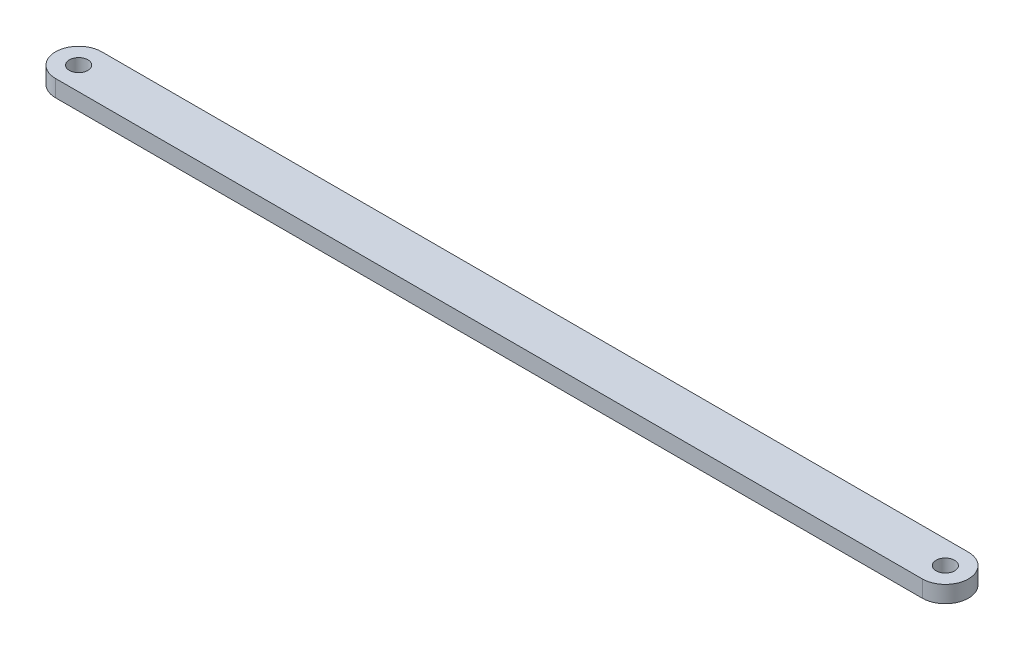
ISO-10303-21;
HEADER;
FILE_DESCRIPTION(('STEP AP214'),'2;1');
FILE_NAME('part.step','',(''),(''),'','','');
FILE_SCHEMA(('AUTOMOTIVE_DESIGN { 1 0 10303 214 1 1 1 1 }'));
ENDSEC;
DATA;
#1=APPLICATION_CONTEXT('core data for automotive mechanical design processes');
#2=APPLICATION_PROTOCOL_DEFINITION('international standard','automotive_design',2000,#1);
#3=PRODUCT_CONTEXT('',#1,'mechanical');
#4=PRODUCT('Part','Part','',(#3));
#5=PRODUCT_RELATED_PRODUCT_CATEGORY('part','',(#4));
#6=PRODUCT_DEFINITION_FORMATION('','',#4);
#7=PRODUCT_DEFINITION_CONTEXT('part definition',#1,'design');
#8=PRODUCT_DEFINITION('design','',#6,#7);
#9=PRODUCT_DEFINITION_SHAPE('','',#8);
#10=(LENGTH_UNIT() NAMED_UNIT(*) SI_UNIT(.MILLI.,.METRE.));
#11=(NAMED_UNIT(*) PLANE_ANGLE_UNIT() SI_UNIT($,.RADIAN.));
#12=(NAMED_UNIT(*) SI_UNIT($,.STERADIAN.) SOLID_ANGLE_UNIT());
#13=UNCERTAINTY_MEASURE_WITH_UNIT(LENGTH_MEASURE(1.E-05),#10,'distance_accuracy_value','');
#14=(GEOMETRIC_REPRESENTATION_CONTEXT(3) GLOBAL_UNCERTAINTY_ASSIGNED_CONTEXT((#13)) GLOBAL_UNIT_ASSIGNED_CONTEXT((#10,
#11,#12)) REPRESENTATION_CONTEXT('',''));
#15=CARTESIAN_POINT('',(0.,0.,0.));
#16=DIRECTION('',(0.,0.,1.));
#17=DIRECTION('',(1.,0.,0.));
#18=AXIS2_PLACEMENT_3D('',#15,#16,#17);
#19=CARTESIAN_POINT('',(0.,2.9,0.));
#20=DIRECTION('',(0.,1.,0.));
#21=DIRECTION('',(0.,0.,1.));
#22=AXIS2_PLACEMENT_3D('',#19,#20,#21);
#23=PLANE('',#22);
#24=CARTESIAN_POINT('',(0.,2.9,0.));
#25=DIRECTION('',(0.,1.,0.));
#26=DIRECTION('',(0.,0.,1.));
#27=AXIS2_PLACEMENT_3D('',#24,#25,#26);
#28=CIRCLE('',#27,1.6);
#29=CARTESIAN_POINT('',(0.,2.9,1.6));
#30=VERTEX_POINT('',#29);
#31=EDGE_CURVE('E112',#30,#30,#28,.T.);
#32=ORIENTED_EDGE('',*,*,#31,.F.);
#33=EDGE_LOOP('',(#32));
#34=FACE_BOUND('',#33,.T.);
#35=CARTESIAN_POINT('',(0.,2.9,0.));
#36=DIRECTION('',(0.,1.,0.));
#37=DIRECTION('',(0.,0.,1.));
#38=AXIS2_PLACEMENT_3D('',#35,#36,#37);
#39=CIRCLE('',#38,4.);
#40=CARTESIAN_POINT('',(0.,2.9,-4.));
#41=VERTEX_POINT('',#40);
#42=CARTESIAN_POINT('',(0.,2.9,4.));
#43=VERTEX_POINT('',#42);
#44=EDGE_CURVE('E92',#41,#43,#39,.T.);
#45=ORIENTED_EDGE('',*,*,#44,.T.);
#46=DIRECTION('',(1.,0.,0.));
#47=VECTOR('',#46,1.);
#48=CARTESIAN_POINT('',(0.,2.9,4.));
#49=LINE('',#48,#47);
#50=CARTESIAN_POINT('',(150.,2.9,4.));
#51=VERTEX_POINT('',#50);
#52=EDGE_CURVE('E87',#43,#51,#49,.T.);
#53=ORIENTED_EDGE('',*,*,#52,.T.);
#54=CARTESIAN_POINT('',(150.,2.9,0.));
#55=DIRECTION('',(0.,1.,0.));
#56=DIRECTION('',(0.,0.,1.));
#57=AXIS2_PLACEMENT_3D('',#54,#55,#56);
#58=CIRCLE('',#57,4.);
#59=CARTESIAN_POINT('',(150.,2.9,-4.));
#60=VERTEX_POINT('',#59);
#61=EDGE_CURVE('E90',#51,#60,#58,.T.);
#62=ORIENTED_EDGE('',*,*,#61,.T.);
#63=DIRECTION('',(-1.,0.,0.));
#64=VECTOR('',#63,1.);
#65=CARTESIAN_POINT('',(0.,2.9,-4.));
#66=LINE('',#65,#64);
#67=EDGE_CURVE('E57',#60,#41,#66,.T.);
#68=ORIENTED_EDGE('',*,*,#67,.T.);
#69=EDGE_LOOP('',(#45,#53,#62,#68));
#70=FACE_BOUND('',#69,.T.);
#71=CARTESIAN_POINT('',(150.,2.9,0.));
#72=DIRECTION('',(0.,1.,0.));
#73=DIRECTION('',(0.,0.,1.));
#74=AXIS2_PLACEMENT_3D('',#71,#72,#73);
#75=CIRCLE('',#74,1.59999999999999);
#76=CARTESIAN_POINT('',(150.,2.9,1.59999999999999));
#77=VERTEX_POINT('',#76);
#78=EDGE_CURVE('E134',#77,#77,#75,.T.);
#79=ORIENTED_EDGE('',*,*,#78,.F.);
#80=EDGE_LOOP('',(#79));
#81=FACE_BOUND('',#80,.T.);
#82=ADVANCED_FACE('F39',(#34,#70,#81),#23,.T.);
#83=CARTESIAN_POINT('',(0.,0.,0.));
#84=DIRECTION('',(0.,1.,0.));
#85=DIRECTION('',(0.,0.,1.));
#86=AXIS2_PLACEMENT_3D('',#83,#84,#85);
#87=PLANE('',#86);
#88=CARTESIAN_POINT('',(0.,0.,0.));
#89=DIRECTION('',(0.,1.,0.));
#90=DIRECTION('',(0.,0.,1.));
#91=AXIS2_PLACEMENT_3D('',#88,#89,#90);
#92=CIRCLE('',#91,4.);
#93=CARTESIAN_POINT('',(0.,0.,-4.));
#94=VERTEX_POINT('',#93);
#95=CARTESIAN_POINT('',(0.,0.,4.));
#96=VERTEX_POINT('',#95);
#97=EDGE_CURVE('E108',#94,#96,#92,.T.);
#98=ORIENTED_EDGE('',*,*,#97,.F.);
#99=DIRECTION('',(-1.,0.,0.));
#100=VECTOR('',#99,1.);
#101=CARTESIAN_POINT('',(0.,0.,-4.));
#102=LINE('',#101,#100);
#103=CARTESIAN_POINT('',(150.,0.,-4.));
#104=VERTEX_POINT('',#103);
#105=EDGE_CURVE('E80',#104,#94,#102,.T.);
#106=ORIENTED_EDGE('',*,*,#105,.F.);
#107=CARTESIAN_POINT('',(150.,0.,0.));
#108=DIRECTION('',(0.,1.,0.));
#109=DIRECTION('',(0.,0.,1.));
#110=AXIS2_PLACEMENT_3D('',#107,#108,#109);
#111=CIRCLE('',#110,4.);
#112=CARTESIAN_POINT('',(150.,0.,4.));
#113=VERTEX_POINT('',#112);
#114=EDGE_CURVE('E74',#113,#104,#111,.T.);
#115=ORIENTED_EDGE('',*,*,#114,.F.);
#116=DIRECTION('',(1.,0.,0.));
#117=VECTOR('',#116,1.);
#118=CARTESIAN_POINT('',(0.,0.,4.));
#119=LINE('',#118,#117);
#120=EDGE_CURVE('E97',#96,#113,#119,.T.);
#121=ORIENTED_EDGE('',*,*,#120,.F.);
#122=EDGE_LOOP('',(#98,#106,#115,#121));
#123=FACE_BOUND('',#122,.T.);
#124=CARTESIAN_POINT('',(0.,0.,0.));
#125=DIRECTION('',(0.,1.,0.));
#126=DIRECTION('',(0.,0.,1.));
#127=AXIS2_PLACEMENT_3D('',#124,#125,#126);
#128=CIRCLE('',#127,1.6);
#129=CARTESIAN_POINT('',(0.,0.,1.6));
#130=VERTEX_POINT('',#129);
#131=EDGE_CURVE('E130',#130,#130,#128,.T.);
#132=ORIENTED_EDGE('',*,*,#131,.T.);
#133=EDGE_LOOP('',(#132));
#134=FACE_BOUND('',#133,.T.);
#135=CARTESIAN_POINT('',(150.,0.,0.));
#136=DIRECTION('',(0.,1.,0.));
#137=DIRECTION('',(0.,0.,1.));
#138=AXIS2_PLACEMENT_3D('',#135,#136,#137);
#139=CIRCLE('',#138,1.59999999999999);
#140=CARTESIAN_POINT('',(150.,0.,1.59999999999999));
#141=VERTEX_POINT('',#140);
#142=EDGE_CURVE('E138',#141,#141,#139,.T.);
#143=ORIENTED_EDGE('',*,*,#142,.T.);
#144=EDGE_LOOP('',(#143));
#145=FACE_BOUND('',#144,.T.);
#146=ADVANCED_FACE('F125',(#123,#134,#145),#87,.F.);
#147=CARTESIAN_POINT('',(0.,2.9,0.));
#148=DIRECTION('',(0.,-1.,0.));
#149=DIRECTION('',(0.,0.,-1.));
#150=AXIS2_PLACEMENT_3D('',#147,#148,#149);
#151=CYLINDRICAL_SURFACE('',#150,4.);
#152=ORIENTED_EDGE('',*,*,#97,.T.);
#153=DIRECTION('',(0.,-1.,0.));
#154=VECTOR('',#153,1.);
#155=CARTESIAN_POINT('',(0.,2.9,4.));
#156=LINE('',#155,#154);
#157=EDGE_CURVE('E11',#43,#96,#156,.T.);
#158=ORIENTED_EDGE('',*,*,#157,.F.);
#159=ORIENTED_EDGE('',*,*,#44,.F.);
#160=DIRECTION('',(0.,-1.,0.));
#161=VECTOR('',#160,1.);
#162=CARTESIAN_POINT('',(0.,2.9,-4.));
#163=LINE('',#162,#161);
#164=EDGE_CURVE('E104',#41,#94,#163,.T.);
#165=ORIENTED_EDGE('',*,*,#164,.T.);
#166=EDGE_LOOP('',(#152,#158,#159,#165));
#167=FACE_BOUND('',#166,.T.);
#168=ADVANCED_FACE('F41',(#167),#151,.T.);
#169=CARTESIAN_POINT('',(0.,2.9,4.));
#170=DIRECTION('',(0.,0.,-1.));
#171=DIRECTION('',(-1.,0.,0.));
#172=AXIS2_PLACEMENT_3D('',#169,#170,#171);
#173=PLANE('',#172);
#174=ORIENTED_EDGE('',*,*,#120,.T.);
#175=DIRECTION('',(0.,-1.,0.));
#176=VECTOR('',#175,1.);
#177=CARTESIAN_POINT('',(150.,2.9,4.));
#178=LINE('',#177,#176);
#179=EDGE_CURVE('E49',#51,#113,#178,.T.);
#180=ORIENTED_EDGE('',*,*,#179,.F.);
#181=ORIENTED_EDGE('',*,*,#52,.F.);
#182=ORIENTED_EDGE('',*,*,#157,.T.);
#183=EDGE_LOOP('',(#174,#180,#181,#182));
#184=FACE_BOUND('',#183,.T.);
#185=ADVANCED_FACE('F96',(#184),#173,.F.);
#186=CARTESIAN_POINT('',(150.,2.9,0.));
#187=DIRECTION('',(0.,-1.,0.));
#188=DIRECTION('',(0.,0.,-1.));
#189=AXIS2_PLACEMENT_3D('',#186,#187,#188);
#190=CYLINDRICAL_SURFACE('',#189,4.);
#191=ORIENTED_EDGE('',*,*,#114,.T.);
#192=DIRECTION('',(0.,-1.,0.));
#193=VECTOR('',#192,1.);
#194=CARTESIAN_POINT('',(150.,2.9,-4.));
#195=LINE('',#194,#193);
#196=EDGE_CURVE('E99',#60,#104,#195,.T.);
#197=ORIENTED_EDGE('',*,*,#196,.F.);
#198=ORIENTED_EDGE('',*,*,#61,.F.);
#199=ORIENTED_EDGE('',*,*,#179,.T.);
#200=EDGE_LOOP('',(#191,#197,#198,#199));
#201=FACE_BOUND('',#200,.T.);
#202=ADVANCED_FACE('F100',(#201),#190,.T.);
#203=CARTESIAN_POINT('',(0.,2.9,-4.));
#204=DIRECTION('',(0.,0.,1.));
#205=DIRECTION('',(1.,0.,0.));
#206=AXIS2_PLACEMENT_3D('',#203,#204,#205);
#207=PLANE('',#206);
#208=ORIENTED_EDGE('',*,*,#105,.T.);
#209=ORIENTED_EDGE('',*,*,#164,.F.);
#210=ORIENTED_EDGE('',*,*,#67,.F.);
#211=ORIENTED_EDGE('',*,*,#196,.T.);
#212=EDGE_LOOP('',(#208,#209,#210,#211));
#213=FACE_BOUND('',#212,.T.);
#214=ADVANCED_FACE('F122',(#213),#207,.F.);
#215=CARTESIAN_POINT('',(0.,2.9,0.));
#216=DIRECTION('',(0.,-1.,0.));
#217=DIRECTION('',(0.,0.,-1.));
#218=AXIS2_PLACEMENT_3D('',#215,#216,#217);
#219=CYLINDRICAL_SURFACE('',#218,1.6);
#220=ORIENTED_EDGE('',*,*,#31,.T.);
#221=EDGE_LOOP('',(#220));
#222=FACE_BOUND('',#221,.T.);
#223=ORIENTED_EDGE('',*,*,#131,.F.);
#224=EDGE_LOOP('',(#223));
#225=FACE_BOUND('',#224,.T.);
#226=ADVANCED_FACE('F157',(#222,#225),#219,.F.);
#227=CARTESIAN_POINT('',(150.,2.9,0.));
#228=DIRECTION('',(0.,-1.,0.));
#229=DIRECTION('',(0.,0.,-1.));
#230=AXIS2_PLACEMENT_3D('',#227,#228,#229);
#231=CYLINDRICAL_SURFACE('',#230,1.59999999999999);
#232=ORIENTED_EDGE('',*,*,#78,.T.);
#233=EDGE_LOOP('',(#232));
#234=FACE_BOUND('',#233,.T.);
#235=ORIENTED_EDGE('',*,*,#142,.F.);
#236=EDGE_LOOP('',(#235));
#237=FACE_BOUND('',#236,.T.);
#238=ADVANCED_FACE('F146',(#234,#237),#231,.F.);
#239=CLOSED_SHELL('',(#82,#146,#168,#185,#202,#214,#226,#238));
#240=MANIFOLD_SOLID_BREP('B2',#239);
#241=ADVANCED_BREP_SHAPE_REPRESENTATION('',(#18,#240),#14);
#242=SHAPE_DEFINITION_REPRESENTATION(#9,#241);
ENDSEC;
END-ISO-10303-21;
